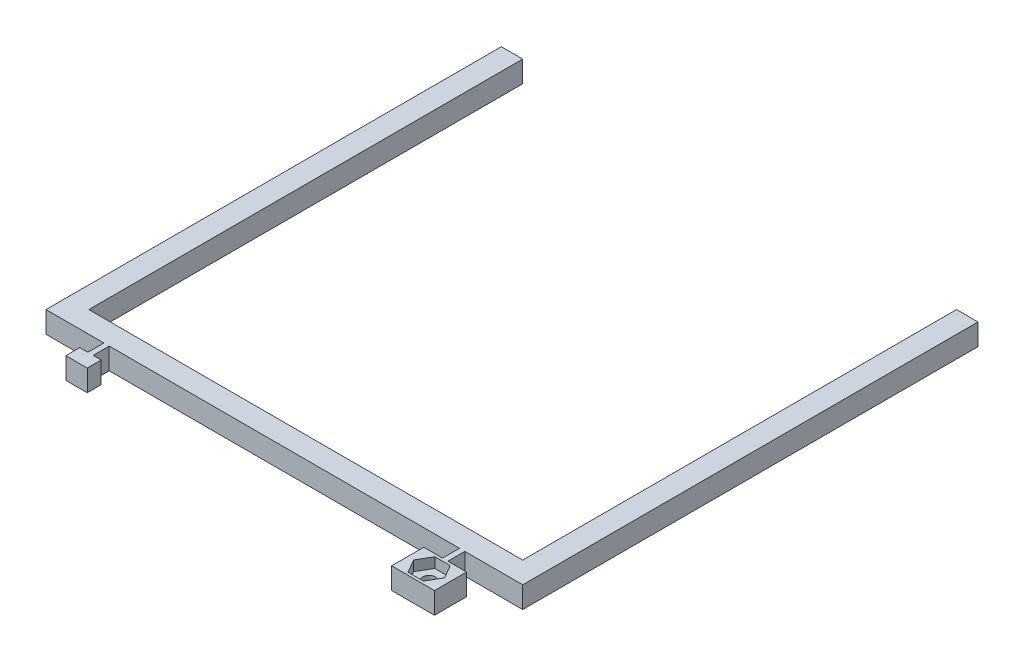
ISO-10303-21;
HEADER;
FILE_DESCRIPTION(('STEP AP214'),'2;1');
FILE_NAME('part.step','',(''),(''),'','','');
FILE_SCHEMA(('AUTOMOTIVE_DESIGN { 1 0 10303 214 1 1 1 1 }'));
ENDSEC;
DATA;
#1=APPLICATION_CONTEXT('core data for automotive mechanical design processes');
#2=APPLICATION_PROTOCOL_DEFINITION('international standard','automotive_design',2000,#1);
#3=PRODUCT_CONTEXT('',#1,'mechanical');
#4=PRODUCT('Part','Part','',(#3));
#5=PRODUCT_RELATED_PRODUCT_CATEGORY('part','',(#4));
#6=PRODUCT_DEFINITION_FORMATION('','',#4);
#7=PRODUCT_DEFINITION_CONTEXT('part definition',#1,'design');
#8=PRODUCT_DEFINITION('design','',#6,#7);
#9=PRODUCT_DEFINITION_SHAPE('','',#8);
#10=(LENGTH_UNIT() NAMED_UNIT(*) SI_UNIT(.MILLI.,.METRE.));
#11=(NAMED_UNIT(*) PLANE_ANGLE_UNIT() SI_UNIT($,.RADIAN.));
#12=(NAMED_UNIT(*) SI_UNIT($,.STERADIAN.) SOLID_ANGLE_UNIT());
#13=UNCERTAINTY_MEASURE_WITH_UNIT(LENGTH_MEASURE(1.E-05),#10,'distance_accuracy_value','');
#14=(GEOMETRIC_REPRESENTATION_CONTEXT(3) GLOBAL_UNCERTAINTY_ASSIGNED_CONTEXT((#13)) GLOBAL_UNIT_ASSIGNED_CONTEXT((#10,
#11,#12)) REPRESENTATION_CONTEXT('',''));
#15=CARTESIAN_POINT('',(0.,0.,0.));
#16=DIRECTION('',(0.,0.,1.));
#17=DIRECTION('',(1.,0.,0.));
#18=AXIS2_PLACEMENT_3D('',#15,#16,#17);
#19=CARTESIAN_POINT('',(-41.5205444091634,5.08,0.));
#20=DIRECTION('',(-1.,0.,0.));
#21=DIRECTION('',(0.,0.,1.));
#22=AXIS2_PLACEMENT_3D('',#19,#20,#21);
#23=PLANE('',#22);
#24=DIRECTION('',(0.,0.,-1.));
#25=VECTOR('',#24,1.);
#26=CARTESIAN_POINT('',(-41.5205444091634,0.,0.));
#27=LINE('',#26,#25);
#28=CARTESIAN_POINT('',(-41.5205444091634,0.,3.81000000000001));
#29=VERTEX_POINT('',#28);
#30=CARTESIAN_POINT('',(-41.5205444091634,0.,0.));
#31=VERTEX_POINT('',#30);
#32=EDGE_CURVE('E247',#29,#31,#27,.T.);
#33=ORIENTED_EDGE('',*,*,#32,.T.);
#34=DIRECTION('',(0.,-1.,0.));
#35=VECTOR('',#34,1.);
#36=CARTESIAN_POINT('',(-41.5205444091634,5.08,0.));
#37=LINE('',#36,#35);
#38=CARTESIAN_POINT('',(-41.5205444091634,5.08,0.));
#39=VERTEX_POINT('',#38);
#40=EDGE_CURVE('E11',#39,#31,#37,.T.);
#41=ORIENTED_EDGE('',*,*,#40,.F.);
#42=DIRECTION('',(0.,0.,-1.));
#43=VECTOR('',#42,1.);
#44=CARTESIAN_POINT('',(-41.5205444091634,5.08,0.));
#45=LINE('',#44,#43);
#46=CARTESIAN_POINT('',(-41.5205444091634,5.08,3.81000000000001));
#47=VERTEX_POINT('',#46);
#48=EDGE_CURVE('E319',#47,#39,#45,.T.);
#49=ORIENTED_EDGE('',*,*,#48,.F.);
#50=DIRECTION('',(0.,-1.,0.));
#51=VECTOR('',#50,1.);
#52=CARTESIAN_POINT('',(-41.5205444091634,5.08,3.81000000000001));
#53=LINE('',#52,#51);
#54=EDGE_CURVE('E243',#47,#29,#53,.T.);
#55=ORIENTED_EDGE('',*,*,#54,.T.);
#56=EDGE_LOOP('',(#33,#41,#49,#55));
#57=FACE_BOUND('',#56,.T.);
#58=ADVANCED_FACE('F38',(#57),#23,.F.);
#59=CARTESIAN_POINT('',(41.5205444091634,5.08,0.));
#60=DIRECTION('',(0.,0.,-1.));
#61=DIRECTION('',(-1.,0.,0.));
#62=AXIS2_PLACEMENT_3D('',#59,#60,#61);
#63=PLANE('',#62);
#64=DIRECTION('',(1.,0.,0.));
#65=VECTOR('',#64,1.);
#66=CARTESIAN_POINT('',(41.5205444091634,0.,0.));
#67=LINE('',#66,#65);
#68=CARTESIAN_POINT('',(41.5205444091634,0.,0.));
#69=VERTEX_POINT('',#68);
#70=EDGE_CURVE('E251',#31,#69,#67,.T.);
#71=ORIENTED_EDGE('',*,*,#70,.T.);
#72=DIRECTION('',(0.,-1.,0.));
#73=VECTOR('',#72,1.);
#74=CARTESIAN_POINT('',(41.5205444091634,5.08,0.));
#75=LINE('',#74,#73);
#76=CARTESIAN_POINT('',(41.5205444091634,5.08,0.));
#77=VERTEX_POINT('',#76);
#78=EDGE_CURVE('E46',#77,#69,#75,.T.);
#79=ORIENTED_EDGE('',*,*,#78,.F.);
#80=DIRECTION('',(1.,0.,0.));
#81=VECTOR('',#80,1.);
#82=CARTESIAN_POINT('',(41.5205444091634,5.08,0.));
#83=LINE('',#82,#81);
#84=EDGE_CURVE('E151',#39,#77,#83,.T.);
#85=ORIENTED_EDGE('',*,*,#84,.F.);
#86=ORIENTED_EDGE('',*,*,#40,.T.);
#87=EDGE_LOOP('',(#71,#79,#85,#86));
#88=FACE_BOUND('',#87,.T.);
#89=ADVANCED_FACE('F630',(#88),#63,.F.);
#90=CARTESIAN_POINT('',(41.5205444091634,5.08,0.));
#91=DIRECTION('',(1.,0.,0.));
#92=DIRECTION('',(0.,0.,-1.));
#93=AXIS2_PLACEMENT_3D('',#90,#91,#92);
#94=PLANE('',#93);
#95=DIRECTION('',(0.,0.,1.));
#96=VECTOR('',#95,1.);
#97=CARTESIAN_POINT('',(41.5205444091634,0.,0.));
#98=LINE('',#97,#96);
#99=CARTESIAN_POINT('',(41.5205444091634,0.,4.01977658114845));
#100=VERTEX_POINT('',#99);
#101=EDGE_CURVE('E255',#69,#100,#98,.T.);
#102=ORIENTED_EDGE('',*,*,#101,.T.);
#103=DIRECTION('',(0.,-1.,0.));
#104=VECTOR('',#103,1.);
#105=CARTESIAN_POINT('',(41.5205444091634,5.08,4.01977658114845));
#106=LINE('',#105,#104);
#107=CARTESIAN_POINT('',(41.5205444091634,5.08,4.01977658114845));
#108=VERTEX_POINT('',#107);
#109=EDGE_CURVE('E394',#108,#100,#106,.T.);
#110=ORIENTED_EDGE('',*,*,#109,.F.);
#111=DIRECTION('',(0.,0.,1.));
#112=VECTOR('',#111,1.);
#113=CARTESIAN_POINT('',(41.5205444091634,5.08,0.));
#114=LINE('',#113,#112);
#115=EDGE_CURVE('E404',#77,#108,#114,.T.);
#116=ORIENTED_EDGE('',*,*,#115,.F.);
#117=ORIENTED_EDGE('',*,*,#78,.T.);
#118=EDGE_LOOP('',(#102,#110,#116,#117));
#119=FACE_BOUND('',#118,.T.);
#120=ADVANCED_FACE('F402',(#119),#94,.F.);
#121=CARTESIAN_POINT('',(41.5205444091634,5.08,4.01977658114845));
#122=DIRECTION('',(0.,0.,1.));
#123=DIRECTION('',(1.,0.,0.));
#124=AXIS2_PLACEMENT_3D('',#121,#122,#123);
#125=PLANE('',#124);
#126=DIRECTION('',(-1.,0.,0.));
#127=VECTOR('',#126,1.);
#128=CARTESIAN_POINT('',(41.5205444091634,0.,4.01977658114845));
#129=LINE('',#128,#127);
#130=CARTESIAN_POINT('',(37.0755444091634,0.,4.01977658114845));
#131=VERTEX_POINT('',#130);
#132=EDGE_CURVE('E258',#100,#131,#129,.T.);
#133=ORIENTED_EDGE('',*,*,#132,.T.);
#134=DIRECTION('',(0.,-1.,0.));
#135=VECTOR('',#134,1.);
#136=CARTESIAN_POINT('',(37.0755444091634,5.08,4.01977658114845));
#137=LINE('',#136,#135);
#138=CARTESIAN_POINT('',(37.0755444091634,5.08,4.01977658114845));
#139=VERTEX_POINT('',#138);
#140=EDGE_CURVE('E390',#139,#131,#137,.T.);
#141=ORIENTED_EDGE('',*,*,#140,.F.);
#142=DIRECTION('',(-1.,0.,0.));
#143=VECTOR('',#142,1.);
#144=CARTESIAN_POINT('',(41.5205444091634,5.08,4.01977658114845));
#145=LINE('',#144,#143);
#146=EDGE_CURVE('E423',#108,#139,#145,.T.);
#147=ORIENTED_EDGE('',*,*,#146,.F.);
#148=ORIENTED_EDGE('',*,*,#109,.T.);
#149=EDGE_LOOP('',(#133,#141,#147,#148));
#150=FACE_BOUND('',#149,.T.);
#151=ADVANCED_FACE('F413',(#150),#125,.F.);
#152=CARTESIAN_POINT('',(37.0755444091634,5.08,4.01977658114845));
#153=DIRECTION('',(1.,0.,0.));
#154=DIRECTION('',(0.,0.,-1.));
#155=AXIS2_PLACEMENT_3D('',#152,#153,#154);
#156=PLANE('',#155);
#157=DIRECTION('',(0.,0.,1.));
#158=VECTOR('',#157,1.);
#159=CARTESIAN_POINT('',(37.0755444091634,0.,4.01977658114845));
#160=LINE('',#159,#158);
#161=CARTESIAN_POINT('',(37.0755444091634,0.,11.6397765811485));
#162=VERTEX_POINT('',#161);
#163=EDGE_CURVE('E261',#131,#162,#160,.T.);
#164=ORIENTED_EDGE('',*,*,#163,.T.);
#165=DIRECTION('',(0.,-1.,0.));
#166=VECTOR('',#165,1.);
#167=CARTESIAN_POINT('',(37.0755444091634,5.08,11.6397765811485));
#168=LINE('',#167,#166);
#169=CARTESIAN_POINT('',(37.0755444091634,5.08,11.6397765811485));
#170=VERTEX_POINT('',#169);
#171=EDGE_CURVE('E386',#170,#162,#168,.T.);
#172=ORIENTED_EDGE('',*,*,#171,.F.);
#173=DIRECTION('',(0.,0.,1.));
#174=VECTOR('',#173,1.);
#175=CARTESIAN_POINT('',(37.0755444091634,5.08,4.01977658114845));
#176=LINE('',#175,#174);
#177=EDGE_CURVE('E419',#139,#170,#176,.T.);
#178=ORIENTED_EDGE('',*,*,#177,.F.);
#179=ORIENTED_EDGE('',*,*,#140,.T.);
#180=EDGE_LOOP('',(#164,#172,#178,#179));
#181=FACE_BOUND('',#180,.T.);
#182=ADVANCED_FACE('F417',(#181),#156,.F.);
#183=CARTESIAN_POINT('',(37.0755444091634,5.08,11.6397765811485));
#184=DIRECTION('',(0.,0.,-1.));
#185=DIRECTION('',(-1.,0.,0.));
#186=AXIS2_PLACEMENT_3D('',#183,#184,#185);
#187=PLANE('',#186);
#188=DIRECTION('',(1.,0.,0.));
#189=VECTOR('',#188,1.);
#190=CARTESIAN_POINT('',(37.0755444091634,0.,11.6397765811485));
#191=LINE('',#190,#189);
#192=CARTESIAN_POINT('',(47.2355444091634,0.,11.6397765811485));
#193=VERTEX_POINT('',#192);
#194=EDGE_CURVE('E264',#162,#193,#191,.T.);
#195=ORIENTED_EDGE('',*,*,#194,.T.);
#196=DIRECTION('',(0.,-1.,0.));
#197=VECTOR('',#196,1.);
#198=CARTESIAN_POINT('',(47.2355444091634,5.08,11.6397765811485));
#199=LINE('',#198,#197);
#200=CARTESIAN_POINT('',(47.2355444091634,5.08,11.6397765811485));
#201=VERTEX_POINT('',#200);
#202=EDGE_CURVE('E382',#201,#193,#199,.T.);
#203=ORIENTED_EDGE('',*,*,#202,.F.);
#204=DIRECTION('',(1.,0.,0.));
#205=VECTOR('',#204,1.);
#206=CARTESIAN_POINT('',(37.0755444091634,5.08,11.6397765811485));
#207=LINE('',#206,#205);
#208=EDGE_CURVE('E422',#170,#201,#207,.T.);
#209=ORIENTED_EDGE('',*,*,#208,.F.);
#210=ORIENTED_EDGE('',*,*,#171,.T.);
#211=EDGE_LOOP('',(#195,#203,#209,#210));
#212=FACE_BOUND('',#211,.T.);
#213=ADVANCED_FACE('F643',(#212),#187,.F.);
#214=CARTESIAN_POINT('',(47.2355444091634,5.08,11.6397765811485));
#215=DIRECTION('',(-1.,0.,0.));
#216=DIRECTION('',(0.,0.,1.));
#217=AXIS2_PLACEMENT_3D('',#214,#215,#216);
#218=PLANE('',#217);
#219=DIRECTION('',(0.,0.,-1.));
#220=VECTOR('',#219,1.);
#221=CARTESIAN_POINT('',(47.2355444091634,0.,11.6397765811485));
#222=LINE('',#221,#220);
#223=CARTESIAN_POINT('',(47.2355444091634,0.,4.01977658114845));
#224=VERTEX_POINT('',#223);
#225=EDGE_CURVE('E267',#193,#224,#222,.T.);
#226=ORIENTED_EDGE('',*,*,#225,.T.);
#227=DIRECTION('',(0.,-1.,0.));
#228=VECTOR('',#227,1.);
#229=CARTESIAN_POINT('',(47.2355444091634,5.08,4.01977658114845));
#230=LINE('',#229,#228);
#231=CARTESIAN_POINT('',(47.2355444091634,5.08,4.01977658114845));
#232=VERTEX_POINT('',#231);
#233=EDGE_CURVE('E378',#232,#224,#230,.T.);
#234=ORIENTED_EDGE('',*,*,#233,.F.);
#235=DIRECTION('',(0.,0.,-1.));
#236=VECTOR('',#235,1.);
#237=CARTESIAN_POINT('',(47.2355444091634,5.08,11.6397765811485));
#238=LINE('',#237,#236);
#239=EDGE_CURVE('E427',#201,#232,#238,.T.);
#240=ORIENTED_EDGE('',*,*,#239,.F.);
#241=ORIENTED_EDGE('',*,*,#202,.T.);
#242=EDGE_LOOP('',(#226,#234,#240,#241));
#243=FACE_BOUND('',#242,.T.);
#244=ADVANCED_FACE('F646',(#243),#218,.F.);
#245=CARTESIAN_POINT('',(47.2355444091634,5.08,4.01977658114845));
#246=DIRECTION('',(0.,0.,1.));
#247=DIRECTION('',(1.,0.,0.));
#248=AXIS2_PLACEMENT_3D('',#245,#246,#247);
#249=PLANE('',#248);
#250=DIRECTION('',(-1.,0.,0.));
#251=VECTOR('',#250,1.);
#252=CARTESIAN_POINT('',(47.2355444091634,0.,4.01977658114845));
#253=LINE('',#252,#251);
#254=CARTESIAN_POINT('',(42.7905444091634,0.,4.01977658114845));
#255=VERTEX_POINT('',#254);
#256=EDGE_CURVE('E270',#224,#255,#253,.T.);
#257=ORIENTED_EDGE('',*,*,#256,.T.);
#258=DIRECTION('',(0.,-1.,0.));
#259=VECTOR('',#258,1.);
#260=CARTESIAN_POINT('',(42.7905444091634,5.08,4.01977658114845));
#261=LINE('',#260,#259);
#262=CARTESIAN_POINT('',(42.7905444091634,5.08,4.01977658114845));
#263=VERTEX_POINT('',#262);
#264=EDGE_CURVE('E374',#263,#255,#261,.T.);
#265=ORIENTED_EDGE('',*,*,#264,.F.);
#266=DIRECTION('',(-1.,0.,0.));
#267=VECTOR('',#266,1.);
#268=CARTESIAN_POINT('',(47.2355444091634,5.08,4.01977658114845));
#269=LINE('',#268,#267);
#270=EDGE_CURVE('E434',#232,#263,#269,.T.);
#271=ORIENTED_EDGE('',*,*,#270,.F.);
#272=ORIENTED_EDGE('',*,*,#233,.T.);
#273=EDGE_LOOP('',(#257,#265,#271,#272));
#274=FACE_BOUND('',#273,.T.);
#275=ADVANCED_FACE('F650',(#274),#249,.F.);
#276=CARTESIAN_POINT('',(42.7905444091634,5.08,4.01977658114845));
#277=DIRECTION('',(-1.,0.,0.));
#278=DIRECTION('',(0.,0.,1.));
#279=AXIS2_PLACEMENT_3D('',#276,#277,#278);
#280=PLANE('',#279);
#281=DIRECTION('',(0.,0.,-1.));
#282=VECTOR('',#281,1.);
#283=CARTESIAN_POINT('',(42.7905444091634,0.,4.01977658114845));
#284=LINE('',#283,#282);
#285=CARTESIAN_POINT('',(42.7905444091634,0.,0.));
#286=VERTEX_POINT('',#285);
#287=EDGE_CURVE('E273',#255,#286,#284,.T.);
#288=ORIENTED_EDGE('',*,*,#287,.T.);
#289=DIRECTION('',(0.,-1.,0.));
#290=VECTOR('',#289,1.);
#291=CARTESIAN_POINT('',(42.7905444091634,5.08,0.));
#292=LINE('',#291,#290);
#293=CARTESIAN_POINT('',(42.7905444091634,5.08,0.));
#294=VERTEX_POINT('',#293);
#295=EDGE_CURVE('E370',#294,#286,#292,.T.);
#296=ORIENTED_EDGE('',*,*,#295,.F.);
#297=DIRECTION('',(0.,0.,-1.));
#298=VECTOR('',#297,1.);
#299=CARTESIAN_POINT('',(42.7905444091634,5.08,4.01977658114845));
#300=LINE('',#299,#298);
#301=EDGE_CURVE('E437',#263,#294,#300,.T.);
#302=ORIENTED_EDGE('',*,*,#301,.F.);
#303=ORIENTED_EDGE('',*,*,#264,.T.);
#304=EDGE_LOOP('',(#288,#296,#302,#303));
#305=FACE_BOUND('',#304,.T.);
#306=ADVANCED_FACE('F654',(#305),#280,.F.);
#307=CARTESIAN_POINT('',(42.7905444091634,5.08,0.));
#308=DIRECTION('',(0.,0.,-1.));
#309=DIRECTION('',(-1.,0.,0.));
#310=AXIS2_PLACEMENT_3D('',#307,#308,#309);
#311=PLANE('',#310);
#312=DIRECTION('',(1.,0.,0.));
#313=VECTOR('',#312,1.);
#314=CARTESIAN_POINT('',(42.7905444091634,0.,0.));
#315=LINE('',#314,#313);
#316=CARTESIAN_POINT('',(56.515,0.,0.));
#317=VERTEX_POINT('',#316);
#318=EDGE_CURVE('E276',#286,#317,#315,.T.);
#319=ORIENTED_EDGE('',*,*,#318,.T.);
#320=DIRECTION('',(0.,-1.,0.));
#321=VECTOR('',#320,1.);
#322=CARTESIAN_POINT('',(56.515,5.08,0.));
#323=LINE('',#322,#321);
#324=CARTESIAN_POINT('',(56.515,5.08,0.));
#325=VERTEX_POINT('',#324);
#326=EDGE_CURVE('E366',#325,#317,#323,.T.);
#327=ORIENTED_EDGE('',*,*,#326,.F.);
#328=DIRECTION('',(1.,0.,0.));
#329=VECTOR('',#328,1.);
#330=CARTESIAN_POINT('',(42.7905444091634,5.08,0.));
#331=LINE('',#330,#329);
#332=EDGE_CURVE('E440',#294,#325,#331,.T.);
#333=ORIENTED_EDGE('',*,*,#332,.F.);
#334=ORIENTED_EDGE('',*,*,#295,.T.);
#335=EDGE_LOOP('',(#319,#327,#333,#334));
#336=FACE_BOUND('',#335,.T.);
#337=ADVANCED_FACE('F658',(#336),#311,.F.);
#338=CARTESIAN_POINT('',(56.515,5.08,0.));
#339=DIRECTION('',(-1.,0.,0.));
#340=DIRECTION('',(0.,0.,1.));
#341=AXIS2_PLACEMENT_3D('',#338,#339,#340);
#342=PLANE('',#341);
#343=DIRECTION('',(0.,0.,-1.));
#344=VECTOR('',#343,1.);
#345=CARTESIAN_POINT('',(56.515,0.,0.));
#346=LINE('',#345,#344);
#347=CARTESIAN_POINT('',(56.515,0.,-107.95));
#348=VERTEX_POINT('',#347);
#349=EDGE_CURVE('E279',#317,#348,#346,.T.);
#350=ORIENTED_EDGE('',*,*,#349,.T.);
#351=DIRECTION('',(0.,-1.,0.));
#352=VECTOR('',#351,1.);
#353=CARTESIAN_POINT('',(56.515,5.08,-107.95));
#354=LINE('',#353,#352);
#355=CARTESIAN_POINT('',(56.515,5.08,-107.95));
#356=VERTEX_POINT('',#355);
#357=EDGE_CURVE('E362',#356,#348,#354,.T.);
#358=ORIENTED_EDGE('',*,*,#357,.F.);
#359=DIRECTION('',(0.,0.,-1.));
#360=VECTOR('',#359,1.);
#361=CARTESIAN_POINT('',(56.515,5.08,0.));
#362=LINE('',#361,#360);
#363=EDGE_CURVE('E443',#325,#356,#362,.T.);
#364=ORIENTED_EDGE('',*,*,#363,.F.);
#365=ORIENTED_EDGE('',*,*,#326,.T.);
#366=EDGE_LOOP('',(#350,#358,#364,#365));
#367=FACE_BOUND('',#366,.T.);
#368=ADVANCED_FACE('F662',(#367),#342,.F.);
#369=CARTESIAN_POINT('',(56.515,5.08,-107.95));
#370=DIRECTION('',(0.,0.,1.));
#371=DIRECTION('',(1.,0.,0.));
#372=AXIS2_PLACEMENT_3D('',#369,#370,#371);
#373=PLANE('',#372);
#374=DIRECTION('',(-1.,0.,0.));
#375=VECTOR('',#374,1.);
#376=CARTESIAN_POINT('',(56.515,0.,-107.95));
#377=LINE('',#376,#375);
#378=CARTESIAN_POINT('',(51.435,0.,-107.95));
#379=VERTEX_POINT('',#378);
#380=EDGE_CURVE('E282',#348,#379,#377,.T.);
#381=ORIENTED_EDGE('',*,*,#380,.T.);
#382=DIRECTION('',(0.,-1.,0.));
#383=VECTOR('',#382,1.);
#384=CARTESIAN_POINT('',(51.435,5.08,-107.95));
#385=LINE('',#384,#383);
#386=CARTESIAN_POINT('',(51.435,5.08,-107.95));
#387=VERTEX_POINT('',#386);
#388=EDGE_CURVE('E358',#387,#379,#385,.T.);
#389=ORIENTED_EDGE('',*,*,#388,.F.);
#390=DIRECTION('',(-1.,0.,0.));
#391=VECTOR('',#390,1.);
#392=CARTESIAN_POINT('',(56.515,5.08,-107.95));
#393=LINE('',#392,#391);
#394=EDGE_CURVE('E446',#356,#387,#393,.T.);
#395=ORIENTED_EDGE('',*,*,#394,.F.);
#396=ORIENTED_EDGE('',*,*,#357,.T.);
#397=EDGE_LOOP('',(#381,#389,#395,#396));
#398=FACE_BOUND('',#397,.T.);
#399=ADVANCED_FACE('F666',(#398),#373,.F.);
#400=CARTESIAN_POINT('',(51.435,5.08,-107.95));
#401=DIRECTION('',(1.,0.,0.));
#402=DIRECTION('',(0.,0.,-1.));
#403=AXIS2_PLACEMENT_3D('',#400,#401,#402);
#404=PLANE('',#403);
#405=DIRECTION('',(0.,0.,1.));
#406=VECTOR('',#405,1.);
#407=CARTESIAN_POINT('',(51.435,0.,-107.95));
#408=LINE('',#407,#406);
#409=CARTESIAN_POINT('',(51.435,0.,-5.07999999999999));
#410=VERTEX_POINT('',#409);
#411=EDGE_CURVE('E285',#379,#410,#408,.T.);
#412=ORIENTED_EDGE('',*,*,#411,.T.);
#413=DIRECTION('',(0.,-1.,0.));
#414=VECTOR('',#413,1.);
#415=CARTESIAN_POINT('',(51.435,5.08,-5.07999999999999));
#416=LINE('',#415,#414);
#417=CARTESIAN_POINT('',(51.435,5.08,-5.07999999999999));
#418=VERTEX_POINT('',#417);
#419=EDGE_CURVE('E354',#418,#410,#416,.T.);
#420=ORIENTED_EDGE('',*,*,#419,.F.);
#421=DIRECTION('',(0.,0.,1.));
#422=VECTOR('',#421,1.);
#423=CARTESIAN_POINT('',(51.435,5.08,-107.95));
#424=LINE('',#423,#422);
#425=EDGE_CURVE('E449',#387,#418,#424,.T.);
#426=ORIENTED_EDGE('',*,*,#425,.F.);
#427=ORIENTED_EDGE('',*,*,#388,.T.);
#428=EDGE_LOOP('',(#412,#420,#426,#427));
#429=FACE_BOUND('',#428,.T.);
#430=ADVANCED_FACE('F670',(#429),#404,.F.);
#431=CARTESIAN_POINT('',(-51.435,5.08,-5.07999999999999));
#432=DIRECTION('',(0.,0.,1.));
#433=DIRECTION('',(1.,0.,0.));
#434=AXIS2_PLACEMENT_3D('',#431,#432,#433);
#435=PLANE('',#434);
#436=DIRECTION('',(-1.,0.,0.));
#437=VECTOR('',#436,1.);
#438=CARTESIAN_POINT('',(-51.435,0.,-5.07999999999999));
#439=LINE('',#438,#437);
#440=CARTESIAN_POINT('',(-51.435,0.,-5.07999999999999));
#441=VERTEX_POINT('',#440);
#442=EDGE_CURVE('E288',#410,#441,#439,.T.);
#443=ORIENTED_EDGE('',*,*,#442,.T.);
#444=DIRECTION('',(0.,-1.,0.));
#445=VECTOR('',#444,1.);
#446=CARTESIAN_POINT('',(-51.435,5.08,-5.07999999999999));
#447=LINE('',#446,#445);
#448=CARTESIAN_POINT('',(-51.435,5.08,-5.07999999999999));
#449=VERTEX_POINT('',#448);
#450=EDGE_CURVE('E350',#449,#441,#447,.T.);
#451=ORIENTED_EDGE('',*,*,#450,.F.);
#452=DIRECTION('',(-1.,0.,0.));
#453=VECTOR('',#452,1.);
#454=CARTESIAN_POINT('',(-51.435,5.08,-5.07999999999999));
#455=LINE('',#454,#453);
#456=EDGE_CURVE('E452',#418,#449,#455,.T.);
#457=ORIENTED_EDGE('',*,*,#456,.F.);
#458=ORIENTED_EDGE('',*,*,#419,.T.);
#459=EDGE_LOOP('',(#443,#451,#457,#458));
#460=FACE_BOUND('',#459,.T.);
#461=ADVANCED_FACE('F674',(#460),#435,.F.);
#462=CARTESIAN_POINT('',(-51.435,5.08,-107.95));
#463=DIRECTION('',(-1.,0.,0.));
#464=DIRECTION('',(0.,0.,1.));
#465=AXIS2_PLACEMENT_3D('',#462,#463,#464);
#466=PLANE('',#465);
#467=DIRECTION('',(0.,0.,-1.));
#468=VECTOR('',#467,1.);
#469=CARTESIAN_POINT('',(-51.435,0.,-107.95));
#470=LINE('',#469,#468);
#471=CARTESIAN_POINT('',(-51.435,0.,-107.95));
#472=VERTEX_POINT('',#471);
#473=EDGE_CURVE('E291',#441,#472,#470,.T.);
#474=ORIENTED_EDGE('',*,*,#473,.T.);
#475=DIRECTION('',(0.,-1.,0.));
#476=VECTOR('',#475,1.);
#477=CARTESIAN_POINT('',(-51.435,5.08,-107.95));
#478=LINE('',#477,#476);
#479=CARTESIAN_POINT('',(-51.435,5.08,-107.95));
#480=VERTEX_POINT('',#479);
#481=EDGE_CURVE('E346',#480,#472,#478,.T.);
#482=ORIENTED_EDGE('',*,*,#481,.F.);
#483=DIRECTION('',(0.,0.,-1.));
#484=VECTOR('',#483,1.);
#485=CARTESIAN_POINT('',(-51.435,5.08,-107.95));
#486=LINE('',#485,#484);
#487=EDGE_CURVE('E455',#449,#480,#486,.T.);
#488=ORIENTED_EDGE('',*,*,#487,.F.);
#489=ORIENTED_EDGE('',*,*,#450,.T.);
#490=EDGE_LOOP('',(#474,#482,#488,#489));
#491=FACE_BOUND('',#490,.T.);
#492=ADVANCED_FACE('F678',(#491),#466,.F.);
#493=CARTESIAN_POINT('',(-56.515,5.08,-107.95));
#494=DIRECTION('',(0.,0.,1.));
#495=DIRECTION('',(1.,0.,0.));
#496=AXIS2_PLACEMENT_3D('',#493,#494,#495);
#497=PLANE('',#496);
#498=DIRECTION('',(-1.,0.,0.));
#499=VECTOR('',#498,1.);
#500=CARTESIAN_POINT('',(-56.515,0.,-107.95));
#501=LINE('',#500,#499);
#502=CARTESIAN_POINT('',(-56.515,0.,-107.95));
#503=VERTEX_POINT('',#502);
#504=EDGE_CURVE('E294',#472,#503,#501,.T.);
#505=ORIENTED_EDGE('',*,*,#504,.T.);
#506=DIRECTION('',(0.,-1.,0.));
#507=VECTOR('',#506,1.);
#508=CARTESIAN_POINT('',(-56.515,5.08,-107.95));
#509=LINE('',#508,#507);
#510=CARTESIAN_POINT('',(-56.515,5.08,-107.95));
#511=VERTEX_POINT('',#510);
#512=EDGE_CURVE('E342',#511,#503,#509,.T.);
#513=ORIENTED_EDGE('',*,*,#512,.F.);
#514=DIRECTION('',(-1.,0.,0.));
#515=VECTOR('',#514,1.);
#516=CARTESIAN_POINT('',(-56.515,5.08,-107.95));
#517=LINE('',#516,#515);
#518=EDGE_CURVE('E458',#480,#511,#517,.T.);
#519=ORIENTED_EDGE('',*,*,#518,.F.);
#520=ORIENTED_EDGE('',*,*,#481,.T.);
#521=EDGE_LOOP('',(#505,#513,#519,#520));
#522=FACE_BOUND('',#521,.T.);
#523=ADVANCED_FACE('F682',(#522),#497,.F.);
#524=CARTESIAN_POINT('',(-56.515,5.08,0.));
#525=DIRECTION('',(1.,0.,0.));
#526=DIRECTION('',(0.,0.,-1.));
#527=AXIS2_PLACEMENT_3D('',#524,#525,#526);
#528=PLANE('',#527);
#529=DIRECTION('',(0.,0.,1.));
#530=VECTOR('',#529,1.);
#531=CARTESIAN_POINT('',(-56.515,0.,0.));
#532=LINE('',#531,#530);
#533=CARTESIAN_POINT('',(-56.515,0.,0.));
#534=VERTEX_POINT('',#533);
#535=EDGE_CURVE('E297',#503,#534,#532,.T.);
#536=ORIENTED_EDGE('',*,*,#535,.T.);
#537=DIRECTION('',(0.,-1.,0.));
#538=VECTOR('',#537,1.);
#539=CARTESIAN_POINT('',(-56.515,5.08,0.));
#540=LINE('',#539,#538);
#541=CARTESIAN_POINT('',(-56.515,5.08,0.));
#542=VERTEX_POINT('',#541);
#543=EDGE_CURVE('E338',#542,#534,#540,.T.);
#544=ORIENTED_EDGE('',*,*,#543,.F.);
#545=DIRECTION('',(0.,0.,1.));
#546=VECTOR('',#545,1.);
#547=CARTESIAN_POINT('',(-56.515,5.08,0.));
#548=LINE('',#547,#546);
#549=EDGE_CURVE('E461',#511,#542,#548,.T.);
#550=ORIENTED_EDGE('',*,*,#549,.F.);
#551=ORIENTED_EDGE('',*,*,#512,.T.);
#552=EDGE_LOOP('',(#536,#544,#550,#551));
#553=FACE_BOUND('',#552,.T.);
#554=ADVANCED_FACE('F686',(#553),#528,.F.);
#555=CARTESIAN_POINT('',(-42.7905444091634,5.08,0.));
#556=DIRECTION('',(0.,0.,-1.));
#557=DIRECTION('',(-1.,0.,0.));
#558=AXIS2_PLACEMENT_3D('',#555,#556,#557);
#559=PLANE('',#558);
#560=DIRECTION('',(1.,0.,0.));
#561=VECTOR('',#560,1.);
#562=CARTESIAN_POINT('',(-42.7905444091634,0.,0.));
#563=LINE('',#562,#561);
#564=CARTESIAN_POINT('',(-42.7905444091634,0.,0.));
#565=VERTEX_POINT('',#564);
#566=EDGE_CURVE('E300',#534,#565,#563,.T.);
#567=ORIENTED_EDGE('',*,*,#566,.T.);
#568=DIRECTION('',(0.,-1.,0.));
#569=VECTOR('',#568,1.);
#570=CARTESIAN_POINT('',(-42.7905444091634,5.08,0.));
#571=LINE('',#570,#569);
#572=CARTESIAN_POINT('',(-42.7905444091634,5.08,0.));
#573=VERTEX_POINT('',#572);
#574=EDGE_CURVE('E334',#573,#565,#571,.T.);
#575=ORIENTED_EDGE('',*,*,#574,.F.);
#576=DIRECTION('',(1.,0.,0.));
#577=VECTOR('',#576,1.);
#578=CARTESIAN_POINT('',(-42.7905444091634,5.08,0.));
#579=LINE('',#578,#577);
#580=EDGE_CURVE('E464',#542,#573,#579,.T.);
#581=ORIENTED_EDGE('',*,*,#580,.F.);
#582=ORIENTED_EDGE('',*,*,#543,.T.);
#583=EDGE_LOOP('',(#567,#575,#581,#582));
#584=FACE_BOUND('',#583,.T.);
#585=ADVANCED_FACE('F690',(#584),#559,.F.);
#586=CARTESIAN_POINT('',(-42.7905444091634,5.08,3.81));
#587=DIRECTION('',(1.,0.,0.));
#588=DIRECTION('',(0.,0.,-1.));
#589=AXIS2_PLACEMENT_3D('',#586,#587,#588);
#590=PLANE('',#589);
#591=DIRECTION('',(0.,0.,1.));
#592=VECTOR('',#591,1.);
#593=CARTESIAN_POINT('',(-42.7905444091634,0.,3.81));
#594=LINE('',#593,#592);
#595=CARTESIAN_POINT('',(-42.7905444091634,0.,3.81));
#596=VERTEX_POINT('',#595);
#597=EDGE_CURVE('E303',#565,#596,#594,.T.);
#598=ORIENTED_EDGE('',*,*,#597,.T.);
#599=DIRECTION('',(0.,-1.,0.));
#600=VECTOR('',#599,1.);
#601=CARTESIAN_POINT('',(-42.7905444091634,5.08,3.81));
#602=LINE('',#601,#600);
#603=CARTESIAN_POINT('',(-42.7905444091634,5.08,3.81));
#604=VERTEX_POINT('',#603);
#605=EDGE_CURVE('E330',#604,#596,#602,.T.);
#606=ORIENTED_EDGE('',*,*,#605,.F.);
#607=DIRECTION('',(0.,0.,1.));
#608=VECTOR('',#607,1.);
#609=CARTESIAN_POINT('',(-42.7905444091634,5.08,3.81));
#610=LINE('',#609,#608);
#611=EDGE_CURVE('E467',#573,#604,#610,.T.);
#612=ORIENTED_EDGE('',*,*,#611,.F.);
#613=ORIENTED_EDGE('',*,*,#574,.T.);
#614=EDGE_LOOP('',(#598,#606,#612,#613));
#615=FACE_BOUND('',#614,.T.);
#616=ADVANCED_FACE('F694',(#615),#590,.F.);
#617=CARTESIAN_POINT('',(-44.6955444091634,5.08,3.81000000000001));
#618=DIRECTION('',(0.,0.,1.));
#619=DIRECTION('',(1.,0.,0.));
#620=AXIS2_PLACEMENT_3D('',#617,#618,#619);
#621=PLANE('',#620);
#622=DIRECTION('',(-1.,0.,0.));
#623=VECTOR('',#622,1.);
#624=CARTESIAN_POINT('',(-44.6955444091634,0.,3.81000000000001));
#625=LINE('',#624,#623);
#626=CARTESIAN_POINT('',(-44.6955444091634,0.,3.81000000000001));
#627=VERTEX_POINT('',#626);
#628=EDGE_CURVE('E306',#596,#627,#625,.T.);
#629=ORIENTED_EDGE('',*,*,#628,.T.);
#630=DIRECTION('',(0.,-1.,0.));
#631=VECTOR('',#630,1.);
#632=CARTESIAN_POINT('',(-44.6955444091634,5.08,3.81000000000001));
#633=LINE('',#632,#631);
#634=CARTESIAN_POINT('',(-44.6955444091634,5.08,3.81000000000001));
#635=VERTEX_POINT('',#634);
#636=EDGE_CURVE('E326',#635,#627,#633,.T.);
#637=ORIENTED_EDGE('',*,*,#636,.F.);
#638=DIRECTION('',(-1.,0.,0.));
#639=VECTOR('',#638,1.);
#640=CARTESIAN_POINT('',(-44.6955444091634,5.08,3.81000000000001));
#641=LINE('',#640,#639);
#642=EDGE_CURVE('E470',#604,#635,#641,.T.);
#643=ORIENTED_EDGE('',*,*,#642,.F.);
#644=ORIENTED_EDGE('',*,*,#605,.T.);
#645=EDGE_LOOP('',(#629,#637,#643,#644));
#646=FACE_BOUND('',#645,.T.);
#647=ADVANCED_FACE('F478',(#646),#621,.F.);
#648=CARTESIAN_POINT('',(-44.6955444091634,5.08,7.112));
#649=DIRECTION('',(1.,0.,0.));
#650=DIRECTION('',(0.,0.,-1.));
#651=AXIS2_PLACEMENT_3D('',#648,#649,#650);
#652=PLANE('',#651);
#653=DIRECTION('',(0.,0.,1.));
#654=VECTOR('',#653,1.);
#655=CARTESIAN_POINT('',(-44.6955444091634,0.,7.112));
#656=LINE('',#655,#654);
#657=CARTESIAN_POINT('',(-44.6955444091634,0.,7.112));
#658=VERTEX_POINT('',#657);
#659=EDGE_CURVE('E309',#627,#658,#656,.T.);
#660=ORIENTED_EDGE('',*,*,#659,.T.);
#661=DIRECTION('',(0.,-1.,0.));
#662=VECTOR('',#661,1.);
#663=CARTESIAN_POINT('',(-44.6955444091634,5.08,7.112));
#664=LINE('',#663,#662);
#665=CARTESIAN_POINT('',(-44.6955444091634,5.08,7.112));
#666=VERTEX_POINT('',#665);
#667=EDGE_CURVE('E236',#666,#658,#664,.T.);
#668=ORIENTED_EDGE('',*,*,#667,.F.);
#669=DIRECTION('',(0.,0.,1.));
#670=VECTOR('',#669,1.);
#671=CARTESIAN_POINT('',(-44.6955444091634,5.08,7.112));
#672=LINE('',#671,#670);
#673=EDGE_CURVE('E222',#635,#666,#672,.T.);
#674=ORIENTED_EDGE('',*,*,#673,.F.);
#675=ORIENTED_EDGE('',*,*,#636,.T.);
#676=EDGE_LOOP('',(#660,#668,#674,#675));
#677=FACE_BOUND('',#676,.T.);
#678=ADVANCED_FACE('F482',(#677),#652,.F.);
#679=CARTESIAN_POINT('',(-39.6155444091634,5.08,7.112));
#680=DIRECTION('',(0.,0.,-1.));
#681=DIRECTION('',(-1.,0.,0.));
#682=AXIS2_PLACEMENT_3D('',#679,#680,#681);
#683=PLANE('',#682);
#684=DIRECTION('',(1.,0.,0.));
#685=VECTOR('',#684,1.);
#686=CARTESIAN_POINT('',(-39.6155444091634,0.,7.112));
#687=LINE('',#686,#685);
#688=CARTESIAN_POINT('',(-39.6155444091634,0.,7.112));
#689=VERTEX_POINT('',#688);
#690=EDGE_CURVE('E232',#658,#689,#687,.T.);
#691=ORIENTED_EDGE('',*,*,#690,.T.);
#692=DIRECTION('',(0.,-1.,0.));
#693=VECTOR('',#692,1.);
#694=CARTESIAN_POINT('',(-39.6155444091634,5.08,7.112));
#695=LINE('',#694,#693);
#696=CARTESIAN_POINT('',(-39.6155444091634,5.08,7.112));
#697=VERTEX_POINT('',#696);
#698=EDGE_CURVE('E229',#697,#689,#695,.T.);
#699=ORIENTED_EDGE('',*,*,#698,.F.);
#700=DIRECTION('',(1.,0.,0.));
#701=VECTOR('',#700,1.);
#702=CARTESIAN_POINT('',(-39.6155444091634,5.08,7.112));
#703=LINE('',#702,#701);
#704=EDGE_CURVE('E215',#666,#697,#703,.T.);
#705=ORIENTED_EDGE('',*,*,#704,.F.);
#706=ORIENTED_EDGE('',*,*,#667,.T.);
#707=EDGE_LOOP('',(#691,#699,#705,#706));
#708=FACE_BOUND('',#707,.T.);
#709=ADVANCED_FACE('F230',(#708),#683,.F.);
#710=CARTESIAN_POINT('',(-39.6155444091634,5.08,3.81000000000001));
#711=DIRECTION('',(-1.,0.,0.));
#712=DIRECTION('',(0.,0.,1.));
#713=AXIS2_PLACEMENT_3D('',#710,#711,#712);
#714=PLANE('',#713);
#715=DIRECTION('',(0.,0.,-1.));
#716=VECTOR('',#715,1.);
#717=CARTESIAN_POINT('',(-39.6155444091634,0.,3.81000000000001));
#718=LINE('',#717,#716);
#719=CARTESIAN_POINT('',(-39.6155444091634,0.,3.81000000000001));
#720=VERTEX_POINT('',#719);
#721=EDGE_CURVE('E314',#689,#720,#718,.T.);
#722=ORIENTED_EDGE('',*,*,#721,.T.);
#723=DIRECTION('',(0.,-1.,0.));
#724=VECTOR('',#723,1.);
#725=CARTESIAN_POINT('',(-39.6155444091634,5.08,3.81000000000001));
#726=LINE('',#725,#724);
#727=CARTESIAN_POINT('',(-39.6155444091634,5.08,3.81000000000001));
#728=VERTEX_POINT('',#727);
#729=EDGE_CURVE('E237',#728,#720,#726,.T.);
#730=ORIENTED_EDGE('',*,*,#729,.F.);
#731=DIRECTION('',(0.,0.,-1.));
#732=VECTOR('',#731,1.);
#733=CARTESIAN_POINT('',(-39.6155444091634,5.08,3.81000000000001));
#734=LINE('',#733,#732);
#735=EDGE_CURVE('E219',#697,#728,#734,.T.);
#736=ORIENTED_EDGE('',*,*,#735,.F.);
#737=ORIENTED_EDGE('',*,*,#698,.T.);
#738=EDGE_LOOP('',(#722,#730,#736,#737));
#739=FACE_BOUND('',#738,.T.);
#740=ADVANCED_FACE('F239',(#739),#714,.F.);
#741=CARTESIAN_POINT('',(-41.5205444091634,5.08,3.81000000000001));
#742=DIRECTION('',(0.,0.,1.));
#743=DIRECTION('',(1.,0.,0.));
#744=AXIS2_PLACEMENT_3D('',#741,#742,#743);
#745=PLANE('',#744);
#746=DIRECTION('',(-1.,0.,0.));
#747=VECTOR('',#746,1.);
#748=CARTESIAN_POINT('',(-41.5205444091634,0.,3.81000000000001));
#749=LINE('',#748,#747);
#750=EDGE_CURVE('E143',#720,#29,#749,.T.);
#751=ORIENTED_EDGE('',*,*,#750,.T.);
#752=ORIENTED_EDGE('',*,*,#54,.F.);
#753=DIRECTION('',(-1.,0.,0.));
#754=VECTOR('',#753,1.);
#755=CARTESIAN_POINT('',(-41.5205444091634,5.08,3.81000000000001));
#756=LINE('',#755,#754);
#757=EDGE_CURVE('E62',#728,#47,#756,.T.);
#758=ORIENTED_EDGE('',*,*,#757,.F.);
#759=ORIENTED_EDGE('',*,*,#729,.T.);
#760=EDGE_LOOP('',(#751,#752,#758,#759));
#761=FACE_BOUND('',#760,.T.);
#762=ADVANCED_FACE('F483',(#761),#745,.F.);
#763=CARTESIAN_POINT('',(0.,5.08,0.));
#764=DIRECTION('',(0.,1.,0.));
#765=DIRECTION('',(0.,0.,1.));
#766=AXIS2_PLACEMENT_3D('',#763,#764,#765);
#767=PLANE('',#766);
#768=DIRECTION('',(-1.,0.,0.));
#769=VECTOR('',#768,1.);
#770=CARTESIAN_POINT('',(43.9886315138405,5.08,4.65477658114845));
#771=LINE('',#770,#769);
#772=CARTESIAN_POINT('',(43.9886315138405,5.08,4.65477658114845));
#773=VERTEX_POINT('',#772);
#774=CARTESIAN_POINT('',(40.3224573044863,5.08,4.65477658114845));
#775=VERTEX_POINT('',#774);
#776=EDGE_CURVE('E53',#773,#775,#771,.T.);
#777=ORIENTED_EDGE('',*,*,#776,.F.);
#778=DIRECTION('',(-0.5,0.,-0.866025403784439));
#779=VECTOR('',#778,1.);
#780=CARTESIAN_POINT('',(45.8217186185175,5.08,7.82977658114846));
#781=LINE('',#780,#779);
#782=CARTESIAN_POINT('',(45.8217186185175,5.08,7.82977658114846));
#783=VERTEX_POINT('',#782);
#784=EDGE_CURVE('E515',#783,#773,#781,.T.);
#785=ORIENTED_EDGE('',*,*,#784,.F.);
#786=DIRECTION('',(0.499999999999999,0.,-0.866025403784439));
#787=VECTOR('',#786,1.);
#788=CARTESIAN_POINT('',(43.9886315138405,5.08,11.0047765811485));
#789=LINE('',#788,#787);
#790=CARTESIAN_POINT('',(43.9886315138405,5.08,11.0047765811485));
#791=VERTEX_POINT('',#790);
#792=EDGE_CURVE('E520',#791,#783,#789,.T.);
#793=ORIENTED_EDGE('',*,*,#792,.F.);
#794=DIRECTION('',(1.,0.,0.));
#795=VECTOR('',#794,1.);
#796=CARTESIAN_POINT('',(40.3224573044863,5.08,11.0047765811485));
#797=LINE('',#796,#795);
#798=CARTESIAN_POINT('',(40.3224573044863,5.08,11.0047765811485));
#799=VERTEX_POINT('',#798);
#800=EDGE_CURVE('E524',#799,#791,#797,.T.);
#801=ORIENTED_EDGE('',*,*,#800,.F.);
#802=DIRECTION('',(0.5,0.,0.866025403784438));
#803=VECTOR('',#802,1.);
#804=CARTESIAN_POINT('',(38.4893701998093,5.08,7.82977658114847));
#805=LINE('',#804,#803);
#806=CARTESIAN_POINT('',(38.4893701998093,5.08,7.82977658114847));
#807=VERTEX_POINT('',#806);
#808=EDGE_CURVE('E528',#807,#799,#805,.T.);
#809=ORIENTED_EDGE('',*,*,#808,.F.);
#810=DIRECTION('',(-0.5,0.,0.866025403784439));
#811=VECTOR('',#810,1.);
#812=CARTESIAN_POINT('',(40.3224573044863,5.08,4.65477658114845));
#813=LINE('',#812,#811);
#814=EDGE_CURVE('E532',#775,#807,#813,.T.);
#815=ORIENTED_EDGE('',*,*,#814,.F.);
#816=EDGE_LOOP('',(#777,#785,#793,#801,#809,#815));
#817=FACE_BOUND('',#816,.T.);
#818=ORIENTED_EDGE('',*,*,#48,.T.);
#819=ORIENTED_EDGE('',*,*,#84,.T.);
#820=ORIENTED_EDGE('',*,*,#115,.T.);
#821=ORIENTED_EDGE('',*,*,#146,.T.);
#822=ORIENTED_EDGE('',*,*,#177,.T.);
#823=ORIENTED_EDGE('',*,*,#208,.T.);
#824=ORIENTED_EDGE('',*,*,#239,.T.);
#825=ORIENTED_EDGE('',*,*,#270,.T.);
#826=ORIENTED_EDGE('',*,*,#301,.T.);
#827=ORIENTED_EDGE('',*,*,#332,.T.);
#828=ORIENTED_EDGE('',*,*,#363,.T.);
#829=ORIENTED_EDGE('',*,*,#394,.T.);
#830=ORIENTED_EDGE('',*,*,#425,.T.);
#831=ORIENTED_EDGE('',*,*,#456,.T.);
#832=ORIENTED_EDGE('',*,*,#487,.T.);
#833=ORIENTED_EDGE('',*,*,#518,.T.);
#834=ORIENTED_EDGE('',*,*,#549,.T.);
#835=ORIENTED_EDGE('',*,*,#580,.T.);
#836=ORIENTED_EDGE('',*,*,#611,.T.);
#837=ORIENTED_EDGE('',*,*,#642,.T.);
#838=ORIENTED_EDGE('',*,*,#673,.T.);
#839=ORIENTED_EDGE('',*,*,#704,.T.);
#840=ORIENTED_EDGE('',*,*,#735,.T.);
#841=ORIENTED_EDGE('',*,*,#757,.T.);
#842=EDGE_LOOP('',(#818,#819,#820,#821,#822,#823,#824,#825,#826,#827,#828,#829,#830,#831,#832,
#833,#834,#835,#836,#837,#838,#839,#840,#841));
#843=FACE_BOUND('',#842,.T.);
#844=ADVANCED_FACE('F217',(#817,#843),#767,.T.);
#845=CARTESIAN_POINT('',(0.,0.,0.));
#846=DIRECTION('',(0.,1.,0.));
#847=DIRECTION('',(0.,0.,1.));
#848=AXIS2_PLACEMENT_3D('',#845,#846,#847);
#849=PLANE('',#848);
#850=CARTESIAN_POINT('',(42.1555444091634,0.,7.82977658114846));
#851=DIRECTION('',(0.,1.,0.));
#852=DIRECTION('',(0.,0.,1.));
#853=AXIS2_PLACEMENT_3D('',#850,#851,#852);
#854=CIRCLE('',#853,1.524);
#855=CARTESIAN_POINT('',(42.1555444091634,0.,9.35377658114846));
#856=VERTEX_POINT('',#855);
#857=EDGE_CURVE('E538',#856,#856,#854,.F.);
#858=ORIENTED_EDGE('',*,*,#857,.F.);
#859=EDGE_LOOP('',(#858));
#860=FACE_BOUND('',#859,.T.);
#861=ORIENTED_EDGE('',*,*,#32,.F.);
#862=ORIENTED_EDGE('',*,*,#750,.F.);
#863=ORIENTED_EDGE('',*,*,#721,.F.);
#864=ORIENTED_EDGE('',*,*,#690,.F.);
#865=ORIENTED_EDGE('',*,*,#659,.F.);
#866=ORIENTED_EDGE('',*,*,#628,.F.);
#867=ORIENTED_EDGE('',*,*,#597,.F.);
#868=ORIENTED_EDGE('',*,*,#566,.F.);
#869=ORIENTED_EDGE('',*,*,#535,.F.);
#870=ORIENTED_EDGE('',*,*,#504,.F.);
#871=ORIENTED_EDGE('',*,*,#473,.F.);
#872=ORIENTED_EDGE('',*,*,#442,.F.);
#873=ORIENTED_EDGE('',*,*,#411,.F.);
#874=ORIENTED_EDGE('',*,*,#380,.F.);
#875=ORIENTED_EDGE('',*,*,#349,.F.);
#876=ORIENTED_EDGE('',*,*,#318,.F.);
#877=ORIENTED_EDGE('',*,*,#287,.F.);
#878=ORIENTED_EDGE('',*,*,#256,.F.);
#879=ORIENTED_EDGE('',*,*,#225,.F.);
#880=ORIENTED_EDGE('',*,*,#194,.F.);
#881=ORIENTED_EDGE('',*,*,#163,.F.);
#882=ORIENTED_EDGE('',*,*,#132,.F.);
#883=ORIENTED_EDGE('',*,*,#101,.F.);
#884=ORIENTED_EDGE('',*,*,#70,.F.);
#885=EDGE_LOOP('',(#861,#862,#863,#864,#865,#866,#867,#868,#869,#870,#871,#872,#873,#874,#875,
#876,#877,#878,#879,#880,#881,#882,#883,#884));
#886=FACE_BOUND('',#885,.T.);
#887=ADVANCED_FACE('F408',(#860,#886),#849,.F.);
#888=CARTESIAN_POINT('',(43.9886315138405,2.667,4.65477658114845));
#889=DIRECTION('',(0.,0.,-1.));
#890=DIRECTION('',(-1.,0.,0.));
#891=AXIS2_PLACEMENT_3D('',#888,#889,#890);
#892=PLANE('',#891);
#893=ORIENTED_EDGE('',*,*,#776,.T.);
#894=DIRECTION('',(0.,1.,0.));
#895=VECTOR('',#894,1.);
#896=CARTESIAN_POINT('',(40.3224573044863,2.667,4.65477658114845));
#897=LINE('',#896,#895);
#898=CARTESIAN_POINT('',(40.3224573044863,2.667,4.65477658114845));
#899=VERTEX_POINT('',#898);
#900=EDGE_CURVE('E492',#899,#775,#897,.T.);
#901=ORIENTED_EDGE('',*,*,#900,.F.);
#902=DIRECTION('',(-1.,0.,0.));
#903=VECTOR('',#902,1.);
#904=CARTESIAN_POINT('',(43.9886315138405,2.667,4.65477658114845));
#905=LINE('',#904,#903);
#906=CARTESIAN_POINT('',(43.9886315138405,2.667,4.65477658114845));
#907=VERTEX_POINT('',#906);
#908=EDGE_CURVE('E519',#907,#899,#905,.T.);
#909=ORIENTED_EDGE('',*,*,#908,.F.);
#910=DIRECTION('',(0.,1.,0.));
#911=VECTOR('',#910,1.);
#912=CARTESIAN_POINT('',(43.9886315138405,2.667,4.65477658114845));
#913=LINE('',#912,#911);
#914=EDGE_CURVE('E252',#907,#773,#913,.T.);
#915=ORIENTED_EDGE('',*,*,#914,.T.);
#916=EDGE_LOOP('',(#893,#901,#909,#915));
#917=FACE_BOUND('',#916,.T.);
#918=ADVANCED_FACE('F582',(#917),#892,.F.);
#919=CARTESIAN_POINT('',(45.8217186185175,2.667,7.82977658114846));
#920=DIRECTION('',(0.866025403784439,0.,-0.499999999999999));
#921=DIRECTION('',(-0.5,0.,-0.866025403784439));
#922=AXIS2_PLACEMENT_3D('',#919,#920,#921);
#923=PLANE('',#922);
#924=ORIENTED_EDGE('',*,*,#784,.T.);
#925=ORIENTED_EDGE('',*,*,#914,.F.);
#926=DIRECTION('',(-0.5,0.,-0.866025403784439));
#927=VECTOR('',#926,1.);
#928=CARTESIAN_POINT('',(45.8217186185175,2.667,7.82977658114846));
#929=LINE('',#928,#927);
#930=CARTESIAN_POINT('',(45.8217186185175,2.667,7.82977658114846));
#931=VERTEX_POINT('',#930);
#932=EDGE_CURVE('E497',#931,#907,#929,.T.);
#933=ORIENTED_EDGE('',*,*,#932,.F.);
#934=DIRECTION('',(0.,1.,0.));
#935=VECTOR('',#934,1.);
#936=CARTESIAN_POINT('',(45.8217186185175,2.667,7.82977658114846));
#937=LINE('',#936,#935);
#938=EDGE_CURVE('E509',#931,#783,#937,.T.);
#939=ORIENTED_EDGE('',*,*,#938,.T.);
#940=EDGE_LOOP('',(#924,#925,#933,#939));
#941=FACE_BOUND('',#940,.T.);
#942=ADVANCED_FACE('F598',(#941),#923,.F.);
#943=CARTESIAN_POINT('',(43.9886315138405,2.667,11.0047765811485));
#944=DIRECTION('',(0.866025403784439,0.,0.499999999999999));
#945=DIRECTION('',(0.499999999999999,0.,-0.866025403784439));
#946=AXIS2_PLACEMENT_3D('',#943,#944,#945);
#947=PLANE('',#946);
#948=ORIENTED_EDGE('',*,*,#792,.T.);
#949=ORIENTED_EDGE('',*,*,#938,.F.);
#950=DIRECTION('',(0.499999999999999,0.,-0.866025403784439));
#951=VECTOR('',#950,1.);
#952=CARTESIAN_POINT('',(43.9886315138405,2.667,11.0047765811485));
#953=LINE('',#952,#951);
#954=CARTESIAN_POINT('',(43.9886315138405,2.667,11.0047765811485));
#955=VERTEX_POINT('',#954);
#956=EDGE_CURVE('E542',#955,#931,#953,.T.);
#957=ORIENTED_EDGE('',*,*,#956,.F.);
#958=DIRECTION('',(0.,1.,0.));
#959=VECTOR('',#958,1.);
#960=CARTESIAN_POINT('',(43.9886315138405,2.667,11.0047765811485));
#961=LINE('',#960,#959);
#962=EDGE_CURVE('E505',#955,#791,#961,.T.);
#963=ORIENTED_EDGE('',*,*,#962,.T.);
#964=EDGE_LOOP('',(#948,#949,#957,#963));
#965=FACE_BOUND('',#964,.T.);
#966=ADVANCED_FACE('F603',(#965),#947,.F.);
#967=CARTESIAN_POINT('',(40.3224573044863,2.667,11.0047765811485));
#968=DIRECTION('',(0.,0.,1.));
#969=DIRECTION('',(1.,0.,0.));
#970=AXIS2_PLACEMENT_3D('',#967,#968,#969);
#971=PLANE('',#970);
#972=ORIENTED_EDGE('',*,*,#800,.T.);
#973=ORIENTED_EDGE('',*,*,#962,.F.);
#974=DIRECTION('',(1.,0.,0.));
#975=VECTOR('',#974,1.);
#976=CARTESIAN_POINT('',(40.3224573044863,2.667,11.0047765811485));
#977=LINE('',#976,#975);
#978=CARTESIAN_POINT('',(40.3224573044863,2.667,11.0047765811485));
#979=VERTEX_POINT('',#978);
#980=EDGE_CURVE('E546',#979,#955,#977,.T.);
#981=ORIENTED_EDGE('',*,*,#980,.F.);
#982=DIRECTION('',(0.,1.,0.));
#983=VECTOR('',#982,1.);
#984=CARTESIAN_POINT('',(40.3224573044863,2.667,11.0047765811485));
#985=LINE('',#984,#983);
#986=EDGE_CURVE('E501',#979,#799,#985,.T.);
#987=ORIENTED_EDGE('',*,*,#986,.T.);
#988=EDGE_LOOP('',(#972,#973,#981,#987));
#989=FACE_BOUND('',#988,.T.);
#990=ADVANCED_FACE('F620',(#989),#971,.F.);
#991=CARTESIAN_POINT('',(38.4893701998093,2.667,7.82977658114847));
#992=DIRECTION('',(-0.866025403784438,0.,0.5));
#993=DIRECTION('',(0.5,0.,0.866025403784438));
#994=AXIS2_PLACEMENT_3D('',#991,#992,#993);
#995=PLANE('',#994);
#996=ORIENTED_EDGE('',*,*,#808,.T.);
#997=ORIENTED_EDGE('',*,*,#986,.F.);
#998=DIRECTION('',(0.5,0.,0.866025403784438));
#999=VECTOR('',#998,1.);
#1000=CARTESIAN_POINT('',(38.4893701998093,2.667,7.82977658114847));
#1001=LINE('',#1000,#999);
#1002=CARTESIAN_POINT('',(38.4893701998093,2.667,7.82977658114847));
#1003=VERTEX_POINT('',#1002);
#1004=EDGE_CURVE('E550',#1003,#979,#1001,.T.);
#1005=ORIENTED_EDGE('',*,*,#1004,.F.);
#1006=DIRECTION('',(0.,1.,0.));
#1007=VECTOR('',#1006,1.);
#1008=CARTESIAN_POINT('',(38.4893701998093,2.667,7.82977658114847));
#1009=LINE('',#1008,#1007);
#1010=EDGE_CURVE('E496',#1003,#807,#1009,.T.);
#1011=ORIENTED_EDGE('',*,*,#1010,.T.);
#1012=EDGE_LOOP('',(#996,#997,#1005,#1011));
#1013=FACE_BOUND('',#1012,.T.);
#1014=ADVANCED_FACE('F616',(#1013),#995,.F.);
#1015=CARTESIAN_POINT('',(40.3224573044863,2.667,4.65477658114845));
#1016=DIRECTION('',(-0.866025403784439,0.,-0.5));
#1017=DIRECTION('',(-0.5,0.,0.866025403784439));
#1018=AXIS2_PLACEMENT_3D('',#1015,#1016,#1017);
#1019=PLANE('',#1018);
#1020=ORIENTED_EDGE('',*,*,#814,.T.);
#1021=ORIENTED_EDGE('',*,*,#1010,.F.);
#1022=DIRECTION('',(-0.5,0.,0.866025403784439));
#1023=VECTOR('',#1022,1.);
#1024=CARTESIAN_POINT('',(40.3224573044863,2.667,4.65477658114845));
#1025=LINE('',#1024,#1023);
#1026=EDGE_CURVE('E554',#899,#1003,#1025,.T.);
#1027=ORIENTED_EDGE('',*,*,#1026,.F.);
#1028=ORIENTED_EDGE('',*,*,#900,.T.);
#1029=EDGE_LOOP('',(#1020,#1021,#1027,#1028));
#1030=FACE_BOUND('',#1029,.T.);
#1031=ADVANCED_FACE('F574',(#1030),#1019,.F.);
#1032=CARTESIAN_POINT('',(0.,2.667,0.));
#1033=DIRECTION('',(0.,1.,0.));
#1034=DIRECTION('',(0.,0.,1.));
#1035=AXIS2_PLACEMENT_3D('',#1032,#1033,#1034);
#1036=PLANE('',#1035);
#1037=CARTESIAN_POINT('',(42.1555444091634,2.667,7.82977658114846));
#1038=DIRECTION('',(0.,1.,0.));
#1039=DIRECTION('',(0.,0.,1.));
#1040=AXIS2_PLACEMENT_3D('',#1037,#1038,#1039);
#1041=CIRCLE('',#1040,1.524);
#1042=CARTESIAN_POINT('',(42.1555444091634,2.667,9.35377658114846));
#1043=VERTEX_POINT('',#1042);
#1044=EDGE_CURVE('E564',#1043,#1043,#1041,.T.);
#1045=ORIENTED_EDGE('',*,*,#1044,.F.);
#1046=EDGE_LOOP('',(#1045));
#1047=FACE_BOUND('',#1046,.T.);
#1048=ORIENTED_EDGE('',*,*,#908,.T.);
#1049=ORIENTED_EDGE('',*,*,#1026,.T.);
#1050=ORIENTED_EDGE('',*,*,#1004,.T.);
#1051=ORIENTED_EDGE('',*,*,#980,.T.);
#1052=ORIENTED_EDGE('',*,*,#956,.T.);
#1053=ORIENTED_EDGE('',*,*,#932,.T.);
#1054=EDGE_LOOP('',(#1048,#1049,#1050,#1051,#1052,#1053));
#1055=FACE_BOUND('',#1054,.T.);
#1056=ADVANCED_FACE('F571',(#1047,#1055),#1036,.T.);
#1057=CARTESIAN_POINT('',(42.1555444091634,-4.31052293811319,7.82977658114846));
#1058=DIRECTION('',(0.,1.,0.));
#1059=DIRECTION('',(0.,0.,1.));
#1060=AXIS2_PLACEMENT_3D('',#1057,#1058,#1059);
#1061=CYLINDRICAL_SURFACE('',#1060,1.524);
#1062=ORIENTED_EDGE('',*,*,#857,.T.);
#1063=EDGE_LOOP('',(#1062));
#1064=FACE_BOUND('',#1063,.T.);
#1065=ORIENTED_EDGE('',*,*,#1044,.T.);
#1066=EDGE_LOOP('',(#1065));
#1067=FACE_BOUND('',#1066,.T.);
#1068=ADVANCED_FACE('F569',(#1064,#1067),#1061,.F.);
#1069=CLOSED_SHELL('',(#58,#89,#120,#151,#182,#213,#244,#275,#306,#337,#368,#399,#430,#461,#492,
#523,#554,#585,#616,#647,#678,#709,#740,#762,#844,#887,#918,#942,#966,#990,#1014,#1031,#1056,#1068));
#1070=MANIFOLD_SOLID_BREP('B2',#1069);
#1071=ADVANCED_BREP_SHAPE_REPRESENTATION('',(#18,#1070),#14);
#1072=SHAPE_DEFINITION_REPRESENTATION(#9,#1071);
ENDSEC;
END-ISO-10303-21;
